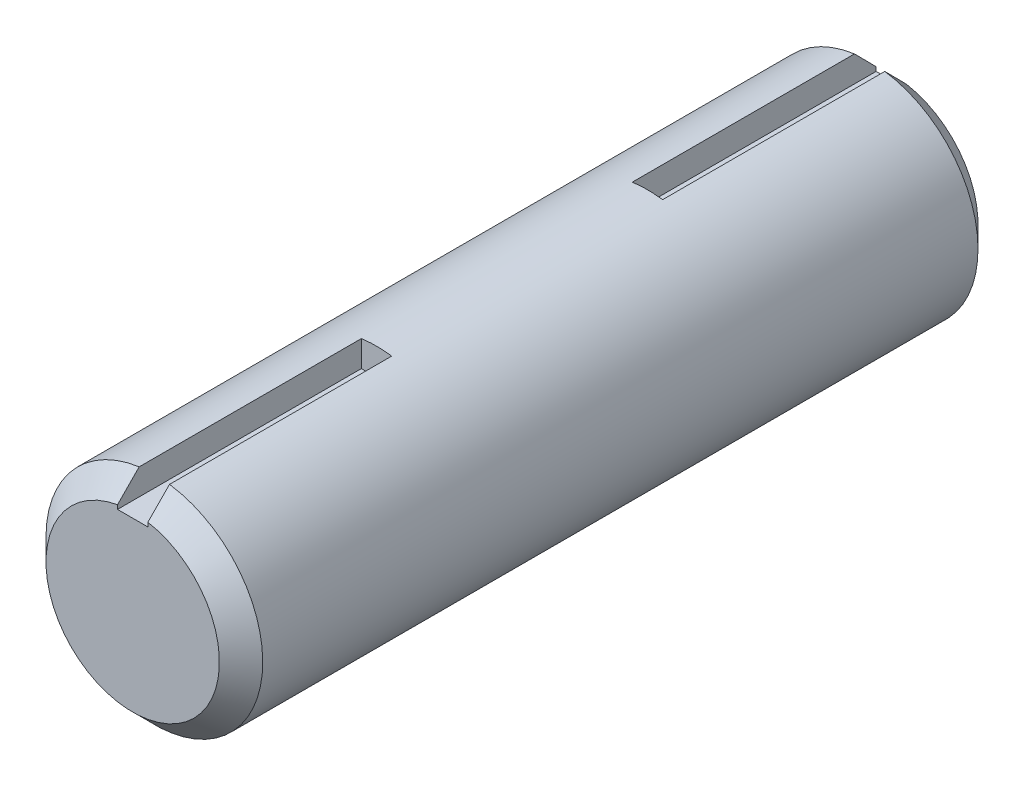
ISO-10303-21;
HEADER;
FILE_DESCRIPTION(('STEP AP214'),'2;1');
FILE_NAME('part.step','',(''),(''),'','','');
FILE_SCHEMA(('AUTOMOTIVE_DESIGN { 1 0 10303 214 1 1 1 1 }'));
ENDSEC;
DATA;
#1=APPLICATION_CONTEXT('core data for automotive mechanical design processes');
#2=APPLICATION_PROTOCOL_DEFINITION('international standard','automotive_design',2000,#1);
#3=PRODUCT_CONTEXT('',#1,'mechanical');
#4=PRODUCT('Part','Part','',(#3));
#5=PRODUCT_RELATED_PRODUCT_CATEGORY('part','',(#4));
#6=PRODUCT_DEFINITION_FORMATION('','',#4);
#7=PRODUCT_DEFINITION_CONTEXT('part definition',#1,'design');
#8=PRODUCT_DEFINITION('design','',#6,#7);
#9=PRODUCT_DEFINITION_SHAPE('','',#8);
#10=(LENGTH_UNIT() NAMED_UNIT(*) SI_UNIT(.MILLI.,.METRE.));
#11=(NAMED_UNIT(*) PLANE_ANGLE_UNIT() SI_UNIT($,.RADIAN.));
#12=(NAMED_UNIT(*) SI_UNIT($,.STERADIAN.) SOLID_ANGLE_UNIT());
#13=UNCERTAINTY_MEASURE_WITH_UNIT(LENGTH_MEASURE(1.E-05),#10,'distance_accuracy_value','');
#14=(GEOMETRIC_REPRESENTATION_CONTEXT(3) GLOBAL_UNCERTAINTY_ASSIGNED_CONTEXT((#13)) GLOBAL_UNIT_ASSIGNED_CONTEXT((#10,
#11,#12)) REPRESENTATION_CONTEXT('',''));
#15=CARTESIAN_POINT('',(0.,0.,0.));
#16=DIRECTION('',(0.,0.,1.));
#17=DIRECTION('',(1.,0.,0.));
#18=AXIS2_PLACEMENT_3D('',#15,#16,#17);
#19=CARTESIAN_POINT('',(0.,0.,-88.9));
#20=DIRECTION('',(0.,0.,1.));
#21=DIRECTION('',(1.,0.,0.));
#22=AXIS2_PLACEMENT_3D('',#19,#20,#21);
#23=CYLINDRICAL_SURFACE('',#22,12.7);
#24=DIRECTION('',(0.,0.,1.));
#25=VECTOR('',#24,1.);
#26=CARTESIAN_POINT('',(1.778,12.5749240951983,-88.9));
#27=LINE('',#26,#25);
#28=CARTESIAN_POINT('',(1.778,12.5749240951983,-2.54000000000001));
#29=VERTEX_POINT('',#28);
#30=CARTESIAN_POINT('',(1.778,12.5749240951983,-28.575));
#31=VERTEX_POINT('',#30);
#32=EDGE_CURVE('E165',#29,#31,#27,.F.);
#33=ORIENTED_EDGE('',*,*,#32,.F.);
#34=CARTESIAN_POINT('',(0.,0.,-2.54000000000001));
#35=DIRECTION('',(0.,0.,1.));
#36=DIRECTION('',(1.,0.,0.));
#37=AXIS2_PLACEMENT_3D('',#34,#35,#36);
#38=CIRCLE('',#37,12.7);
#39=CARTESIAN_POINT('',(-1.778,12.5749240951983,-2.54000000000002));
#40=VERTEX_POINT('',#39);
#41=EDGE_CURVE('E186',#29,#40,#38,.F.);
#42=ORIENTED_EDGE('',*,*,#41,.T.);
#43=DIRECTION('',(0.,0.,1.));
#44=VECTOR('',#43,1.);
#45=CARTESIAN_POINT('',(-1.778,12.5749240951983,-88.9));
#46=LINE('',#45,#44);
#47=CARTESIAN_POINT('',(-1.778,12.5749240951983,-28.575));
#48=VERTEX_POINT('',#47);
#49=EDGE_CURVE('E169',#48,#40,#46,.T.);
#50=ORIENTED_EDGE('',*,*,#49,.F.);
#51=CARTESIAN_POINT('',(0.,0.,-28.575));
#52=DIRECTION('',(0.,0.,1.));
#53=DIRECTION('',(1.,0.,0.));
#54=AXIS2_PLACEMENT_3D('',#51,#52,#53);
#55=CIRCLE('',#54,12.7);
#56=EDGE_CURVE('E174',#48,#31,#55,.F.);
#57=ORIENTED_EDGE('',*,*,#56,.T.);
#58=EDGE_LOOP('',(#33,#42,#50,#57));
#59=FACE_BOUND('',#58,.T.);
#60=DIRECTION('',(0.,0.,1.));
#61=VECTOR('',#60,1.);
#62=CARTESIAN_POINT('',(-1.778,12.5749240951983,-88.9));
#63=LINE('',#62,#61);
#64=CARTESIAN_POINT('',(-1.778,12.5749240951983,-60.325));
#65=VERTEX_POINT('',#64);
#66=CARTESIAN_POINT('',(-1.778,12.5749240951983,-86.36));
#67=VERTEX_POINT('',#66);
#68=EDGE_CURVE('E145',#65,#67,#63,.F.);
#69=ORIENTED_EDGE('',*,*,#68,.T.);
#70=CARTESIAN_POINT('',(0.,0.,-86.36));
#71=DIRECTION('',(0.,0.,1.));
#72=DIRECTION('',(1.,0.,0.));
#73=AXIS2_PLACEMENT_3D('',#70,#71,#72);
#74=CIRCLE('',#73,12.7);
#75=CARTESIAN_POINT('',(1.778,12.5749240951983,-86.36));
#76=VERTEX_POINT('',#75);
#77=EDGE_CURVE('E218',#67,#76,#74,.T.);
#78=ORIENTED_EDGE('',*,*,#77,.T.);
#79=DIRECTION('',(0.,0.,1.));
#80=VECTOR('',#79,1.);
#81=CARTESIAN_POINT('',(1.778,12.5749240951983,-88.9));
#82=LINE('',#81,#80);
#83=CARTESIAN_POINT('',(1.778,12.5749240951983,-60.325));
#84=VERTEX_POINT('',#83);
#85=EDGE_CURVE('E142',#76,#84,#82,.T.);
#86=ORIENTED_EDGE('',*,*,#85,.T.);
#87=CARTESIAN_POINT('',(0.,0.,-60.325));
#88=DIRECTION('',(0.,0.,-1.));
#89=DIRECTION('',(-1.,0.,0.));
#90=AXIS2_PLACEMENT_3D('',#87,#88,#89);
#91=CIRCLE('',#90,12.7);
#92=EDGE_CURVE('E134',#84,#65,#91,.F.);
#93=ORIENTED_EDGE('',*,*,#92,.T.);
#94=EDGE_LOOP('',(#69,#78,#86,#93));
#95=FACE_BOUND('',#94,.T.);
#96=ADVANCED_FACE('F33',(#59,#95),#23,.T.);
#97=CARTESIAN_POINT('',(0.,0.,-88.9));
#98=DIRECTION('',(0.,0.,1.));
#99=DIRECTION('',(1.,0.,0.));
#100=AXIS2_PLACEMENT_3D('',#97,#98,#99);
#101=PLANE('',#100);
#102=DIRECTION('',(0.,1.,0.));
#103=VECTOR('',#102,1.);
#104=CARTESIAN_POINT('',(1.778,12.7,-88.9));
#105=LINE('',#104,#103);
#106=CARTESIAN_POINT('',(1.778,9.525,-88.9));
#107=VERTEX_POINT('',#106);
#108=CARTESIAN_POINT('',(1.778,10.0032152830977,-88.9));
#109=VERTEX_POINT('',#108);
#110=EDGE_CURVE('E128',#107,#109,#105,.T.);
#111=ORIENTED_EDGE('',*,*,#110,.T.);
#112=CARTESIAN_POINT('',(0.,0.,-88.9));
#113=DIRECTION('',(0.,0.,1.));
#114=DIRECTION('',(1.,0.,0.));
#115=AXIS2_PLACEMENT_3D('',#112,#113,#114);
#116=CIRCLE('',#115,10.16);
#117=CARTESIAN_POINT('',(-1.778,10.0032152830977,-88.9));
#118=VERTEX_POINT('',#117);
#119=EDGE_CURVE('E46',#109,#118,#116,.F.);
#120=ORIENTED_EDGE('',*,*,#119,.T.);
#121=DIRECTION('',(0.,1.,0.));
#122=VECTOR('',#121,1.);
#123=CARTESIAN_POINT('',(-1.778,0.,-88.9));
#124=LINE('',#123,#122);
#125=CARTESIAN_POINT('',(-1.778,9.525,-88.9));
#126=VERTEX_POINT('',#125);
#127=EDGE_CURVE('E215',#126,#118,#124,.T.);
#128=ORIENTED_EDGE('',*,*,#127,.F.);
#129=DIRECTION('',(1.,0.,0.));
#130=VECTOR('',#129,1.);
#131=CARTESIAN_POINT('',(-1.778,9.525,-88.9));
#132=LINE('',#131,#130);
#133=EDGE_CURVE('E137',#126,#107,#132,.T.);
#134=ORIENTED_EDGE('',*,*,#133,.T.);
#135=EDGE_LOOP('',(#111,#120,#128,#134));
#136=FACE_BOUND('',#135,.T.);
#137=ADVANCED_FACE('F208',(#136),#101,.F.);
#138=CARTESIAN_POINT('',(0.,0.,0.));
#139=DIRECTION('',(0.,0.,1.));
#140=DIRECTION('',(1.,0.,0.));
#141=AXIS2_PLACEMENT_3D('',#138,#139,#140);
#142=PLANE('',#141);
#143=DIRECTION('',(0.,-1.,0.));
#144=VECTOR('',#143,1.);
#145=CARTESIAN_POINT('',(-1.778,0.,0.));
#146=LINE('',#145,#144);
#147=CARTESIAN_POINT('',(-1.778,10.0032152830977,0.));
#148=VERTEX_POINT('',#147);
#149=CARTESIAN_POINT('',(-1.778,9.525,0.));
#150=VERTEX_POINT('',#149);
#151=EDGE_CURVE('E172',#148,#150,#146,.T.);
#152=ORIENTED_EDGE('',*,*,#151,.F.);
#153=CARTESIAN_POINT('',(0.,0.,0.));
#154=DIRECTION('',(0.,0.,1.));
#155=DIRECTION('',(1.,0.,0.));
#156=AXIS2_PLACEMENT_3D('',#153,#154,#155);
#157=CIRCLE('',#156,10.16);
#158=CARTESIAN_POINT('',(1.778,10.0032152830977,0.));
#159=VERTEX_POINT('',#158);
#160=EDGE_CURVE('E177',#148,#159,#157,.T.);
#161=ORIENTED_EDGE('',*,*,#160,.T.);
#162=DIRECTION('',(0.,1.,0.));
#163=VECTOR('',#162,1.);
#164=CARTESIAN_POINT('',(1.778,12.7,0.));
#165=LINE('',#164,#163);
#166=CARTESIAN_POINT('',(1.778,9.525,0.));
#167=VERTEX_POINT('',#166);
#168=EDGE_CURVE('E152',#167,#159,#165,.T.);
#169=ORIENTED_EDGE('',*,*,#168,.F.);
#170=DIRECTION('',(1.,0.,0.));
#171=VECTOR('',#170,1.);
#172=CARTESIAN_POINT('',(-1.778,9.525,0.));
#173=LINE('',#172,#171);
#174=EDGE_CURVE('E148',#150,#167,#173,.T.);
#175=ORIENTED_EDGE('',*,*,#174,.F.);
#176=EDGE_LOOP('',(#152,#161,#169,#175));
#177=FACE_BOUND('',#176,.T.);
#178=ADVANCED_FACE('F206',(#177),#142,.T.);
#179=CARTESIAN_POINT('',(-1.778,12.7,-28.575));
#180=DIRECTION('',(-1.,0.,0.));
#181=DIRECTION('',(0.,-1.,0.));
#182=AXIS2_PLACEMENT_3D('',#179,#180,#181);
#183=PLANE('',#182);
#184=ORIENTED_EDGE('',*,*,#49,.T.);
#185=CARTESIAN_POINT('',(-1.778,12.5749240951983,-2.54000000000001));
#186=CARTESIAN_POINT('',(-1.778,12.3608799824703,-2.32806520841416));
#187=CARTESIAN_POINT('',(-1.778,12.1467841306499,-2.11618264838937));
#188=CARTESIAN_POINT('',(-1.778,11.7184683349003,-1.6925432036806));
#189=CARTESIAN_POINT('',(-1.778,11.5042483910316,-1.48078631893524));
#190=CARTESIAN_POINT('',(-1.778,11.0756635561285,-1.05741919824062));
#191=CARTESIAN_POINT('',(-1.778,10.8612986650723,-0.845808962313237));
#192=CARTESIAN_POINT('',(-1.778,10.4323947879161,-0.422764794877952));
#193=CARTESIAN_POINT('',(-1.778,10.2178558017308,-0.211330863456486));
#194=CARTESIAN_POINT('',(-1.778,10.0032152830977,0.));
#195=B_SPLINE_CURVE_WITH_KNOTS('',3,(#185,#186,#187,#188,#189,#190,#191,#192,#193,#194),
.UNSPECIFIED.,.F.,.F.,(4,2,2,2,4),(0.,0.903648807276452,1.80729717294373,2.71094567341704,
3.61459461668156),.UNSPECIFIED.);
#196=EDGE_CURVE('E210',#40,#148,#195,.T.);
#197=ORIENTED_EDGE('',*,*,#196,.T.);
#198=ORIENTED_EDGE('',*,*,#151,.T.);
#199=DIRECTION('',(0.,0.,1.));
#200=VECTOR('',#199,1.);
#201=CARTESIAN_POINT('',(-1.778,9.525,-28.575));
#202=LINE('',#201,#200);
#203=CARTESIAN_POINT('',(-1.778,9.525,-28.575));
#204=VERTEX_POINT('',#203);
#205=EDGE_CURVE('E158',#204,#150,#202,.T.);
#206=ORIENTED_EDGE('',*,*,#205,.F.);
#207=DIRECTION('',(0.,-1.,0.));
#208=VECTOR('',#207,1.);
#209=CARTESIAN_POINT('',(-1.778,12.7,-28.575));
#210=LINE('',#209,#208);
#211=EDGE_CURVE('E149',#48,#204,#210,.T.);
#212=ORIENTED_EDGE('',*,*,#211,.F.);
#213=EDGE_LOOP('',(#184,#197,#198,#206,#212));
#214=FACE_BOUND('',#213,.T.);
#215=ADVANCED_FACE('F197',(#214),#183,.F.);
#216=CARTESIAN_POINT('',(1.778,12.7,-28.575));
#217=DIRECTION('',(1.,0.,0.));
#218=DIRECTION('',(0.,1.,0.));
#219=AXIS2_PLACEMENT_3D('',#216,#217,#218);
#220=PLANE('',#219);
#221=ORIENTED_EDGE('',*,*,#168,.T.);
#222=CARTESIAN_POINT('',(1.778,10.0032152830977,0.));
#223=CARTESIAN_POINT('',(1.778,10.2178558017308,-0.211330863456486));
#224=CARTESIAN_POINT('',(1.778,10.4323947879161,-0.422764794877952));
#225=CARTESIAN_POINT('',(1.778,10.8612986650723,-0.845808962313238));
#226=CARTESIAN_POINT('',(1.778,11.0756635561285,-1.05741919824062));
#227=CARTESIAN_POINT('',(1.778,11.5042483910316,-1.48078631893524));
#228=CARTESIAN_POINT('',(1.778,11.7184683349003,-1.6925432036806));
#229=CARTESIAN_POINT('',(1.778,12.1467841306499,-2.11618264838937));
#230=CARTESIAN_POINT('',(1.778,12.3608799824703,-2.32806520841416));
#231=CARTESIAN_POINT('',(1.778,12.5749240951983,-2.54000000000001));
#232=B_SPLINE_CURVE_WITH_KNOTS('',3,(#222,#223,#224,#225,#226,#227,#228,#229,#230,#231),
.UNSPECIFIED.,.F.,.F.,(4,2,2,2,4),(0.,0.903648943264514,1.80729744373783,2.7109458094051,
3.61459461668156),.UNSPECIFIED.);
#233=EDGE_CURVE('E180',#159,#29,#232,.T.);
#234=ORIENTED_EDGE('',*,*,#233,.T.);
#235=ORIENTED_EDGE('',*,*,#32,.T.);
#236=DIRECTION('',(0.,1.,0.));
#237=VECTOR('',#236,1.);
#238=CARTESIAN_POINT('',(1.778,12.7,-28.575));
#239=LINE('',#238,#237);
#240=CARTESIAN_POINT('',(1.778,9.525,-28.575));
#241=VERTEX_POINT('',#240);
#242=EDGE_CURVE('E155',#241,#31,#239,.T.);
#243=ORIENTED_EDGE('',*,*,#242,.F.);
#244=DIRECTION('',(0.,0.,1.));
#245=VECTOR('',#244,1.);
#246=CARTESIAN_POINT('',(1.778,9.525,-28.575));
#247=LINE('',#246,#245);
#248=EDGE_CURVE('E163',#241,#167,#247,.T.);
#249=ORIENTED_EDGE('',*,*,#248,.T.);
#250=EDGE_LOOP('',(#221,#234,#235,#243,#249));
#251=FACE_BOUND('',#250,.T.);
#252=ADVANCED_FACE('F191',(#251),#220,.F.);
#253=CARTESIAN_POINT('',(-1.778,9.525,-28.575));
#254=DIRECTION('',(0.,-1.,0.));
#255=DIRECTION('',(0.,0.,-1.));
#256=AXIS2_PLACEMENT_3D('',#253,#254,#255);
#257=PLANE('',#256);
#258=ORIENTED_EDGE('',*,*,#174,.T.);
#259=ORIENTED_EDGE('',*,*,#248,.F.);
#260=DIRECTION('',(1.,0.,0.));
#261=VECTOR('',#260,1.);
#262=CARTESIAN_POINT('',(-1.778,9.525,-28.575));
#263=LINE('',#262,#261);
#264=EDGE_CURVE('E151',#204,#241,#263,.T.);
#265=ORIENTED_EDGE('',*,*,#264,.F.);
#266=ORIENTED_EDGE('',*,*,#205,.T.);
#267=EDGE_LOOP('',(#258,#259,#265,#266));
#268=FACE_BOUND('',#267,.T.);
#269=ADVANCED_FACE('F196',(#268),#257,.F.);
#270=CARTESIAN_POINT('',(-1.778,9.525,-28.575));
#271=DIRECTION('',(0.,0.,1.));
#272=DIRECTION('',(1.,0.,0.));
#273=AXIS2_PLACEMENT_3D('',#270,#271,#272);
#274=PLANE('',#273);
#275=ORIENTED_EDGE('',*,*,#211,.T.);
#276=ORIENTED_EDGE('',*,*,#264,.T.);
#277=ORIENTED_EDGE('',*,*,#242,.T.);
#278=ORIENTED_EDGE('',*,*,#56,.F.);
#279=EDGE_LOOP('',(#275,#276,#277,#278));
#280=FACE_BOUND('',#279,.T.);
#281=ADVANCED_FACE('F199',(#280),#274,.T.);
#282=CARTESIAN_POINT('',(0.,0.,0.));
#283=DIRECTION('',(0.,0.,-1.));
#284=DIRECTION('',(-1.,0.,0.));
#285=AXIS2_PLACEMENT_3D('',#282,#283,#284);
#286=CONICAL_SURFACE('',#285,10.16,0.785398163397445);
#287=ORIENTED_EDGE('',*,*,#196,.F.);
#288=ORIENTED_EDGE('',*,*,#41,.F.);
#289=ORIENTED_EDGE('',*,*,#233,.F.);
#290=ORIENTED_EDGE('',*,*,#160,.F.);
#291=EDGE_LOOP('',(#287,#288,#289,#290));
#292=FACE_BOUND('',#291,.T.);
#293=ADVANCED_FACE('F188',(#292),#286,.T.);
#294=CARTESIAN_POINT('',(-1.778,12.7,-60.325));
#295=DIRECTION('',(1.,0.,0.));
#296=DIRECTION('',(0.,1.,0.));
#297=AXIS2_PLACEMENT_3D('',#294,#295,#296);
#298=PLANE('',#297);
#299=ORIENTED_EDGE('',*,*,#127,.T.);
#300=CARTESIAN_POINT('',(-1.778,10.0032152830977,-88.9));
#301=CARTESIAN_POINT('',(-1.778,10.2178558017308,-88.6886691365435));
#302=CARTESIAN_POINT('',(-1.778,10.4323947879161,-88.477235205122));
#303=CARTESIAN_POINT('',(-1.778,10.8612986650723,-88.0541910376868));
#304=CARTESIAN_POINT('',(-1.778,11.0756635561285,-87.8425808017594));
#305=CARTESIAN_POINT('',(-1.778,11.5042483910316,-87.4192136810648));
#306=CARTESIAN_POINT('',(-1.778,11.7184683349003,-87.2074567963194));
#307=CARTESIAN_POINT('',(-1.778,12.1467841306499,-86.7838173516106));
#308=CARTESIAN_POINT('',(-1.778,12.3608799824703,-86.5719347915859));
#309=CARTESIAN_POINT('',(-1.778,12.5749240951983,-86.36));
#310=B_SPLINE_CURVE_WITH_KNOTS('',3,(#300,#301,#302,#303,#304,#305,#306,#307,#308,#309),
.UNSPECIFIED.,.F.,.F.,(4,2,2,2,4),(0.,0.903648943264519,1.80729744373784,2.71094580940512,
3.61459461668156),.UNSPECIFIED.);
#311=EDGE_CURVE('E11',#118,#67,#310,.T.);
#312=ORIENTED_EDGE('',*,*,#311,.T.);
#313=ORIENTED_EDGE('',*,*,#68,.F.);
#314=DIRECTION('',(0.,-1.,0.));
#315=VECTOR('',#314,1.);
#316=CARTESIAN_POINT('',(-1.778,12.7,-60.325));
#317=LINE('',#316,#315);
#318=CARTESIAN_POINT('',(-1.778,9.525,-60.325));
#319=VERTEX_POINT('',#318);
#320=EDGE_CURVE('E135',#65,#319,#317,.T.);
#321=ORIENTED_EDGE('',*,*,#320,.T.);
#322=DIRECTION('',(0.,0.,-1.));
#323=VECTOR('',#322,1.);
#324=CARTESIAN_POINT('',(-1.778,9.525,-60.325));
#325=LINE('',#324,#323);
#326=EDGE_CURVE('E120',#319,#126,#325,.T.);
#327=ORIENTED_EDGE('',*,*,#326,.T.);
#328=EDGE_LOOP('',(#299,#312,#313,#321,#327));
#329=FACE_BOUND('',#328,.T.);
#330=ADVANCED_FACE('F229',(#329),#298,.T.);
#331=CARTESIAN_POINT('',(-1.778,9.525,-60.325));
#332=DIRECTION('',(0.,1.,0.));
#333=DIRECTION('',(0.,0.,1.));
#334=AXIS2_PLACEMENT_3D('',#331,#332,#333);
#335=PLANE('',#334);
#336=ORIENTED_EDGE('',*,*,#133,.F.);
#337=ORIENTED_EDGE('',*,*,#326,.F.);
#338=DIRECTION('',(1.,0.,0.));
#339=VECTOR('',#338,1.);
#340=CARTESIAN_POINT('',(-1.778,9.525,-60.325));
#341=LINE('',#340,#339);
#342=CARTESIAN_POINT('',(1.778,9.525,-60.325));
#343=VERTEX_POINT('',#342);
#344=EDGE_CURVE('E115',#319,#343,#341,.T.);
#345=ORIENTED_EDGE('',*,*,#344,.T.);
#346=DIRECTION('',(0.,0.,-1.));
#347=VECTOR('',#346,1.);
#348=CARTESIAN_POINT('',(1.778,9.525,-60.325));
#349=LINE('',#348,#347);
#350=EDGE_CURVE('E118',#343,#107,#349,.T.);
#351=ORIENTED_EDGE('',*,*,#350,.T.);
#352=EDGE_LOOP('',(#336,#337,#345,#351));
#353=FACE_BOUND('',#352,.T.);
#354=ADVANCED_FACE('F117',(#353),#335,.T.);
#355=CARTESIAN_POINT('',(1.778,12.7,-60.325));
#356=DIRECTION('',(-1.,0.,0.));
#357=DIRECTION('',(0.,-1.,0.));
#358=AXIS2_PLACEMENT_3D('',#355,#356,#357);
#359=PLANE('',#358);
#360=ORIENTED_EDGE('',*,*,#85,.F.);
#361=CARTESIAN_POINT('',(1.778,12.5749240951983,-86.36));
#362=CARTESIAN_POINT('',(1.778,12.3608799824703,-86.5719347915858));
#363=CARTESIAN_POINT('',(1.778,12.1467841306499,-86.7838173516106));
#364=CARTESIAN_POINT('',(1.778,11.7184683349003,-87.2074567963194));
#365=CARTESIAN_POINT('',(1.778,11.5042483910316,-87.4192136810648));
#366=CARTESIAN_POINT('',(1.778,11.0756635561285,-87.8425808017594));
#367=CARTESIAN_POINT('',(1.778,10.8612986650723,-88.0541910376868));
#368=CARTESIAN_POINT('',(1.778,10.4323947879161,-88.477235205122));
#369=CARTESIAN_POINT('',(1.778,10.2178558017308,-88.6886691365435));
#370=CARTESIAN_POINT('',(1.778,10.0032152830977,-88.9));
#371=B_SPLINE_CURVE_WITH_KNOTS('',3,(#361,#362,#363,#364,#365,#366,#367,#368,#369,#370),
.UNSPECIFIED.,.F.,.F.,(4,2,2,2,4),(0.,0.903648807276447,1.80729717294372,2.71094567341704,
3.61459461668156),.UNSPECIFIED.);
#372=EDGE_CURVE('E60',#76,#109,#371,.T.);
#373=ORIENTED_EDGE('',*,*,#372,.T.);
#374=ORIENTED_EDGE('',*,*,#110,.F.);
#375=ORIENTED_EDGE('',*,*,#350,.F.);
#376=DIRECTION('',(0.,1.,0.));
#377=VECTOR('',#376,1.);
#378=CARTESIAN_POINT('',(1.778,12.7,-60.325));
#379=LINE('',#378,#377);
#380=EDGE_CURVE('E124',#343,#84,#379,.T.);
#381=ORIENTED_EDGE('',*,*,#380,.T.);
#382=EDGE_LOOP('',(#360,#373,#374,#375,#381));
#383=FACE_BOUND('',#382,.T.);
#384=ADVANCED_FACE('F127',(#383),#359,.T.);
#385=CARTESIAN_POINT('',(-1.778,9.525,-60.325));
#386=DIRECTION('',(0.,0.,-1.));
#387=DIRECTION('',(1.,0.,0.));
#388=AXIS2_PLACEMENT_3D('',#385,#386,#387);
#389=PLANE('',#388);
#390=ORIENTED_EDGE('',*,*,#380,.F.);
#391=ORIENTED_EDGE('',*,*,#344,.F.);
#392=ORIENTED_EDGE('',*,*,#320,.F.);
#393=ORIENTED_EDGE('',*,*,#92,.F.);
#394=EDGE_LOOP('',(#390,#391,#392,#393));
#395=FACE_BOUND('',#394,.T.);
#396=ADVANCED_FACE('F132',(#395),#389,.T.);
#397=CARTESIAN_POINT('',(0.,0.,-86.36));
#398=DIRECTION('',(0.,0.,1.));
#399=DIRECTION('',(1.,0.,0.));
#400=AXIS2_PLACEMENT_3D('',#397,#398,#399);
#401=CONICAL_SURFACE('',#400,12.7,0.785398163397452);
#402=ORIENTED_EDGE('',*,*,#311,.F.);
#403=ORIENTED_EDGE('',*,*,#119,.F.);
#404=ORIENTED_EDGE('',*,*,#372,.F.);
#405=ORIENTED_EDGE('',*,*,#77,.F.);
#406=EDGE_LOOP('',(#402,#403,#404,#405));
#407=FACE_BOUND('',#406,.T.);
#408=ADVANCED_FACE('F35',(#407),#401,.T.);
#409=CLOSED_SHELL('',(#96,#137,#178,#215,#252,#269,#281,#293,#330,#354,#384,#396,#408));
#410=MANIFOLD_SOLID_BREP('B2',#409);
#411=ADVANCED_BREP_SHAPE_REPRESENTATION('',(#18,#410),#14);
#412=SHAPE_DEFINITION_REPRESENTATION(#9,#411);
ENDSEC;
END-ISO-10303-21;
